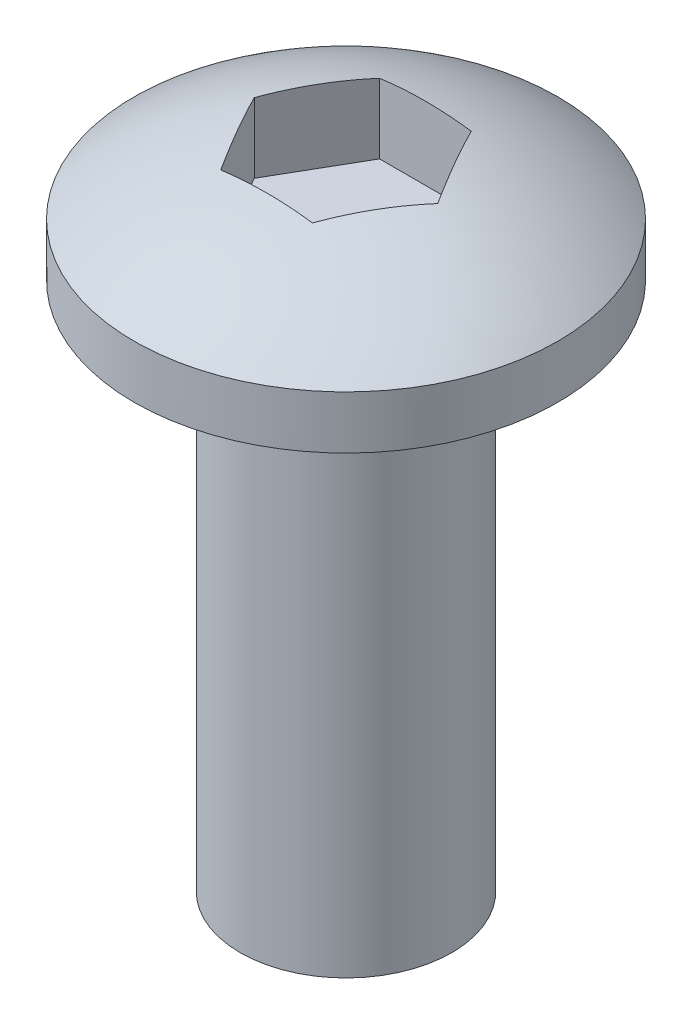
ISO-10303-21;
HEADER;
FILE_DESCRIPTION(('STEP AP214'),'2;1');
FILE_NAME('part.step','',(''),(''),'','','');
FILE_SCHEMA(('AUTOMOTIVE_DESIGN { 1 0 10303 214 1 1 1 1 }'));
ENDSEC;
DATA;
#1=APPLICATION_CONTEXT('core data for automotive mechanical design processes');
#2=APPLICATION_PROTOCOL_DEFINITION('international standard','automotive_design',2000,#1);
#3=PRODUCT_CONTEXT('',#1,'mechanical');
#4=PRODUCT('Part','Part','',(#3));
#5=PRODUCT_RELATED_PRODUCT_CATEGORY('part','',(#4));
#6=PRODUCT_DEFINITION_FORMATION('','',#4);
#7=PRODUCT_DEFINITION_CONTEXT('part definition',#1,'design');
#8=PRODUCT_DEFINITION('design','',#6,#7);
#9=PRODUCT_DEFINITION_SHAPE('','',#8);
#10=(LENGTH_UNIT() NAMED_UNIT(*) SI_UNIT(.MILLI.,.METRE.));
#11=(NAMED_UNIT(*) PLANE_ANGLE_UNIT() SI_UNIT($,.RADIAN.));
#12=(NAMED_UNIT(*) SI_UNIT($,.STERADIAN.) SOLID_ANGLE_UNIT());
#13=UNCERTAINTY_MEASURE_WITH_UNIT(LENGTH_MEASURE(1.E-05),#10,'distance_accuracy_value','');
#14=(GEOMETRIC_REPRESENTATION_CONTEXT(3) GLOBAL_UNCERTAINTY_ASSIGNED_CONTEXT((#13)) GLOBAL_UNIT_ASSIGNED_CONTEXT((#10,
#11,#12)) REPRESENTATION_CONTEXT('',''));
#15=CARTESIAN_POINT('',(0.,0.,0.));
#16=DIRECTION('',(0.,0.,1.));
#17=DIRECTION('',(1.,0.,0.));
#18=AXIS2_PLACEMENT_3D('',#15,#16,#17);
#19=CARTESIAN_POINT('',(0.,5.,0.));
#20=DIRECTION('',(0.,-1.,0.));
#21=DIRECTION('',(0.,0.,-1.));
#22=AXIS2_PLACEMENT_3D('',#19,#20,#21);
#23=CYLINDRICAL_SURFACE('',#22,1.);
#24=CARTESIAN_POINT('',(0.,5.,0.));
#25=DIRECTION('',(0.,1.,0.));
#26=DIRECTION('',(0.,0.,1.));
#27=AXIS2_PLACEMENT_3D('',#24,#25,#26);
#28=CIRCLE('',#27,1.);
#29=CARTESIAN_POINT('',(0.,5.,1.));
#30=VERTEX_POINT('',#29);
#31=EDGE_CURVE('E155',#30,#30,#28,.T.);
#32=ORIENTED_EDGE('',*,*,#31,.F.);
#33=EDGE_LOOP('',(#32));
#34=FACE_BOUND('',#33,.T.);
#35=CARTESIAN_POINT('',(0.,0.,0.));
#36=DIRECTION('',(0.,1.,0.));
#37=DIRECTION('',(0.,0.,1.));
#38=AXIS2_PLACEMENT_3D('',#35,#36,#37);
#39=CIRCLE('',#38,1.);
#40=CARTESIAN_POINT('',(0.,0.,1.));
#41=VERTEX_POINT('',#40);
#42=EDGE_CURVE('E154',#41,#41,#39,.T.);
#43=ORIENTED_EDGE('',*,*,#42,.T.);
#44=EDGE_LOOP('',(#43));
#45=FACE_BOUND('',#44,.T.);
#46=ADVANCED_FACE('F42',(#34,#45),#23,.T.);
#47=CARTESIAN_POINT('',(0.,0.,0.));
#48=DIRECTION('',(0.,1.,0.));
#49=DIRECTION('',(0.,0.,1.));
#50=AXIS2_PLACEMENT_3D('',#47,#48,#49);
#51=PLANE('',#50);
#52=ORIENTED_EDGE('',*,*,#42,.F.);
#53=EDGE_LOOP('',(#52));
#54=FACE_BOUND('',#53,.T.);
#55=ADVANCED_FACE('F200',(#54),#51,.F.);
#56=CARTESIAN_POINT('',(0.,5.,0.));
#57=DIRECTION('',(0.,-1.,0.));
#58=DIRECTION('',(0.,0.,-1.));
#59=AXIS2_PLACEMENT_3D('',#56,#57,#58);
#60=PLANE('',#59);
#61=ORIENTED_EDGE('',*,*,#31,.T.);
#62=EDGE_LOOP('',(#61));
#63=FACE_BOUND('',#62,.T.);
#64=CARTESIAN_POINT('',(0.,5.,0.));
#65=DIRECTION('',(0.,-1.,0.));
#66=DIRECTION('',(0.,0.,-1.));
#67=AXIS2_PLACEMENT_3D('',#64,#65,#66);
#68=CIRCLE('',#67,2.);
#69=CARTESIAN_POINT('',(0.,5.,-2.));
#70=VERTEX_POINT('',#69);
#71=EDGE_CURVE('E133',#70,#70,#68,.T.);
#72=ORIENTED_EDGE('',*,*,#71,.T.);
#73=EDGE_LOOP('',(#72));
#74=FACE_BOUND('',#73,.T.);
#75=ADVANCED_FACE('F205',(#63,#74),#60,.T.);
#76=CARTESIAN_POINT('',(0.,2.87511905031866,0.));
#77=DIRECTION('',(0.,-1.,0.));
#78=DIRECTION('',(1.,0.,0.));
#79=AXIS2_PLACEMENT_3D('',#76,#77,#78);
#80=SPHERICAL_SURFACE('',#79,3.3);
#81=CARTESIAN_POINT('',(0.649519052838329,2.87511905031866,0.375));
#82=DIRECTION('',(0.866025403784439,0.,0.5));
#83=DIRECTION('',(0.5,0.,-0.866025403784439));
#84=AXIS2_PLACEMENT_3D('',#81,#82,#83);
#85=CIRCLE('',#84,3.21364279284428);
#86=CARTESIAN_POINT('',(0.866025403784439,6.05945571593679,0.));
#87=VERTEX_POINT('',#86);
#88=CARTESIAN_POINT('',(0.433012701892219,6.05945571593679,0.750000000000001));
#89=VERTEX_POINT('',#88);
#90=EDGE_CURVE('E159',#87,#89,#85,.T.);
#91=ORIENTED_EDGE('',*,*,#90,.T.);
#92=CARTESIAN_POINT('',(0.,2.87511905031866,0.750000000000001));
#93=DIRECTION('',(0.,0.,1.));
#94=DIRECTION('',(1.,0.,0.));
#95=AXIS2_PLACEMENT_3D('',#92,#93,#94);
#96=CIRCLE('',#95,3.21364279284428);
#97=CARTESIAN_POINT('',(-0.43301270189222,6.05945571593679,0.750000000000001));
#98=VERTEX_POINT('',#97);
#99=EDGE_CURVE('E11',#89,#98,#96,.T.);
#100=ORIENTED_EDGE('',*,*,#99,.T.);
#101=CARTESIAN_POINT('',(-0.64951905283833,2.87511905031866,0.375000000000001));
#102=DIRECTION('',(-0.866025403784439,0.,0.5));
#103=DIRECTION('',(0.5,0.,0.866025403784439));
#104=AXIS2_PLACEMENT_3D('',#101,#102,#103);
#105=CIRCLE('',#104,3.21364279284428);
#106=CARTESIAN_POINT('',(-0.86602540378444,6.05945571593679,0.));
#107=VERTEX_POINT('',#106);
#108=EDGE_CURVE('E50',#98,#107,#105,.T.);
#109=ORIENTED_EDGE('',*,*,#108,.T.);
#110=CARTESIAN_POINT('',(-0.64951905283833,2.87511905031866,-0.375));
#111=DIRECTION('',(-0.866025403784439,0.,-0.5));
#112=DIRECTION('',(-0.5,0.,0.866025403784439));
#113=AXIS2_PLACEMENT_3D('',#110,#111,#112);
#114=CIRCLE('',#113,3.21364279284428);
#115=CARTESIAN_POINT('',(-0.43301270189222,6.05945571593679,-0.750000000000002));
#116=VERTEX_POINT('',#115);
#117=EDGE_CURVE('E173',#107,#116,#114,.T.);
#118=ORIENTED_EDGE('',*,*,#117,.T.);
#119=CARTESIAN_POINT('',(0.,2.87511905031866,-0.750000000000002));
#120=DIRECTION('',(0.,0.,-1.));
#121=DIRECTION('',(-1.,0.,0.));
#122=AXIS2_PLACEMENT_3D('',#119,#120,#121);
#123=CIRCLE('',#122,3.21364279284428);
#124=CARTESIAN_POINT('',(0.433012701892218,6.05945571593679,-0.750000000000002));
#125=VERTEX_POINT('',#124);
#126=EDGE_CURVE('E169',#116,#125,#123,.T.);
#127=ORIENTED_EDGE('',*,*,#126,.T.);
#128=CARTESIAN_POINT('',(0.649519052838329,2.87511905031866,-0.375));
#129=DIRECTION('',(0.866025403784438,0.,-0.5));
#130=DIRECTION('',(-0.5,0.,-0.866025403784439));
#131=AXIS2_PLACEMENT_3D('',#128,#129,#130);
#132=CIRCLE('',#131,3.21364279284428);
#133=EDGE_CURVE('E165',#125,#87,#132,.T.);
#134=ORIENTED_EDGE('',*,*,#133,.T.);
#135=EDGE_LOOP('',(#91,#100,#109,#118,#127,#134));
#136=FACE_BOUND('',#135,.T.);
#137=CARTESIAN_POINT('',(0.,5.5,0.));
#138=DIRECTION('',(0.,-1.,0.));
#139=DIRECTION('',(0.,0.,-1.));
#140=AXIS2_PLACEMENT_3D('',#137,#138,#139);
#141=CIRCLE('',#140,2.);
#142=CARTESIAN_POINT('',(0.,5.5,-2.));
#143=VERTEX_POINT('',#142);
#144=EDGE_CURVE('E150',#143,#143,#141,.T.);
#145=ORIENTED_EDGE('',*,*,#144,.F.);
#146=EDGE_LOOP('',(#145));
#147=FACE_BOUND('',#146,.T.);
#148=ADVANCED_FACE('F178',(#136,#147),#80,.T.);
#149=CARTESIAN_POINT('',(0.,5.,0.));
#150=DIRECTION('',(0.,-1.,0.));
#151=DIRECTION('',(0.,0.,-1.));
#152=AXIS2_PLACEMENT_3D('',#149,#150,#151);
#153=CYLINDRICAL_SURFACE('',#152,2.);
#154=ORIENTED_EDGE('',*,*,#144,.T.);
#155=EDGE_LOOP('',(#154));
#156=FACE_BOUND('',#155,.T.);
#157=ORIENTED_EDGE('',*,*,#71,.F.);
#158=EDGE_LOOP('',(#157));
#159=FACE_BOUND('',#158,.T.);
#160=ADVANCED_FACE('F196',(#156,#159),#153,.T.);
#161=CARTESIAN_POINT('',(-0.43301270189222,5.4,0.750000000000001));
#162=DIRECTION('',(0.,0.,1.));
#163=DIRECTION('',(1.,0.,0.));
#164=AXIS2_PLACEMENT_3D('',#161,#162,#163);
#165=PLANE('',#164);
#166=DIRECTION('',(0.,1.,0.));
#167=VECTOR('',#166,1.);
#168=CARTESIAN_POINT('',(0.433012701892219,5.4,0.750000000000001));
#169=LINE('',#168,#167);
#170=CARTESIAN_POINT('',(0.433012701892219,5.4,0.750000000000001));
#171=VERTEX_POINT('',#170);
#172=EDGE_CURVE('E57',#171,#89,#169,.T.);
#173=ORIENTED_EDGE('',*,*,#172,.F.);
#174=DIRECTION('',(1.,0.,0.));
#175=VECTOR('',#174,1.);
#176=CARTESIAN_POINT('',(-0.43301270189222,5.4,0.750000000000001));
#177=LINE('',#176,#175);
#178=CARTESIAN_POINT('',(-0.43301270189222,5.4,0.750000000000001));
#179=VERTEX_POINT('',#178);
#180=EDGE_CURVE('E96',#179,#171,#177,.T.);
#181=ORIENTED_EDGE('',*,*,#180,.F.);
#182=DIRECTION('',(0.,1.,0.));
#183=VECTOR('',#182,1.);
#184=CARTESIAN_POINT('',(-0.43301270189222,5.4,0.750000000000001));
#185=LINE('',#184,#183);
#186=EDGE_CURVE('E130',#179,#98,#185,.T.);
#187=ORIENTED_EDGE('',*,*,#186,.T.);
#188=ORIENTED_EDGE('',*,*,#99,.F.);
#189=EDGE_LOOP('',(#173,#181,#187,#188));
#190=FACE_BOUND('',#189,.T.);
#191=ADVANCED_FACE('F94',(#190),#165,.F.);
#192=CARTESIAN_POINT('',(-0.86602540378444,5.4,0.));
#193=DIRECTION('',(-0.866025403784439,0.,0.5));
#194=DIRECTION('',(0.5,0.,0.866025403784439));
#195=AXIS2_PLACEMENT_3D('',#192,#193,#194);
#196=PLANE('',#195);
#197=ORIENTED_EDGE('',*,*,#186,.F.);
#198=DIRECTION('',(0.5,0.,0.866025403784439));
#199=VECTOR('',#198,1.);
#200=CARTESIAN_POINT('',(-0.86602540378444,5.4,0.));
#201=LINE('',#200,#199);
#202=CARTESIAN_POINT('',(-0.86602540378444,5.4,0.));
#203=VERTEX_POINT('',#202);
#204=EDGE_CURVE('E101',#203,#179,#201,.T.);
#205=ORIENTED_EDGE('',*,*,#204,.F.);
#206=DIRECTION('',(0.,1.,0.));
#207=VECTOR('',#206,1.);
#208=CARTESIAN_POINT('',(-0.86602540378444,5.4,0.));
#209=LINE('',#208,#207);
#210=EDGE_CURVE('E134',#203,#107,#209,.T.);
#211=ORIENTED_EDGE('',*,*,#210,.T.);
#212=ORIENTED_EDGE('',*,*,#108,.F.);
#213=EDGE_LOOP('',(#197,#205,#211,#212));
#214=FACE_BOUND('',#213,.T.);
#215=ADVANCED_FACE('F188',(#214),#196,.F.);
#216=CARTESIAN_POINT('',(-0.43301270189222,5.4,-0.750000000000002));
#217=DIRECTION('',(-0.866025403784439,0.,-0.5));
#218=DIRECTION('',(-0.5,0.,0.866025403784439));
#219=AXIS2_PLACEMENT_3D('',#216,#217,#218);
#220=PLANE('',#219);
#221=ORIENTED_EDGE('',*,*,#210,.F.);
#222=DIRECTION('',(-0.5,0.,0.866025403784439));
#223=VECTOR('',#222,1.);
#224=CARTESIAN_POINT('',(-0.43301270189222,5.4,-0.750000000000002));
#225=LINE('',#224,#223);
#226=CARTESIAN_POINT('',(-0.43301270189222,5.4,-0.750000000000002));
#227=VERTEX_POINT('',#226);
#228=EDGE_CURVE('E125',#227,#203,#225,.T.);
#229=ORIENTED_EDGE('',*,*,#228,.F.);
#230=DIRECTION('',(0.,1.,0.));
#231=VECTOR('',#230,1.);
#232=CARTESIAN_POINT('',(-0.43301270189222,5.4,-0.750000000000002));
#233=LINE('',#232,#231);
#234=EDGE_CURVE('E137',#227,#116,#233,.T.);
#235=ORIENTED_EDGE('',*,*,#234,.T.);
#236=ORIENTED_EDGE('',*,*,#117,.F.);
#237=EDGE_LOOP('',(#221,#229,#235,#236));
#238=FACE_BOUND('',#237,.T.);
#239=ADVANCED_FACE('F187',(#238),#220,.F.);
#240=CARTESIAN_POINT('',(0.433012701892218,5.4,-0.750000000000002));
#241=DIRECTION('',(0.,0.,-1.));
#242=DIRECTION('',(-1.,0.,0.));
#243=AXIS2_PLACEMENT_3D('',#240,#241,#242);
#244=PLANE('',#243);
#245=ORIENTED_EDGE('',*,*,#234,.F.);
#246=DIRECTION('',(-1.,0.,0.));
#247=VECTOR('',#246,1.);
#248=CARTESIAN_POINT('',(0.433012701892218,5.4,-0.750000000000002));
#249=LINE('',#248,#247);
#250=CARTESIAN_POINT('',(0.433012701892218,5.4,-0.750000000000002));
#251=VERTEX_POINT('',#250);
#252=EDGE_CURVE('E121',#251,#227,#249,.T.);
#253=ORIENTED_EDGE('',*,*,#252,.F.);
#254=DIRECTION('',(0.,1.,0.));
#255=VECTOR('',#254,1.);
#256=CARTESIAN_POINT('',(0.433012701892218,5.4,-0.750000000000002));
#257=LINE('',#256,#255);
#258=EDGE_CURVE('E141',#251,#125,#257,.T.);
#259=ORIENTED_EDGE('',*,*,#258,.T.);
#260=ORIENTED_EDGE('',*,*,#126,.F.);
#261=EDGE_LOOP('',(#245,#253,#259,#260));
#262=FACE_BOUND('',#261,.T.);
#263=ADVANCED_FACE('F185',(#262),#244,.F.);
#264=CARTESIAN_POINT('',(0.866025403784439,5.4,0.));
#265=DIRECTION('',(0.866025403784438,0.,-0.5));
#266=DIRECTION('',(-0.5,0.,-0.866025403784439));
#267=AXIS2_PLACEMENT_3D('',#264,#265,#266);
#268=PLANE('',#267);
#269=ORIENTED_EDGE('',*,*,#258,.F.);
#270=DIRECTION('',(-0.5,0.,-0.866025403784439));
#271=VECTOR('',#270,1.);
#272=CARTESIAN_POINT('',(0.866025403784439,5.4,0.));
#273=LINE('',#272,#271);
#274=CARTESIAN_POINT('',(0.866025403784439,5.4,0.));
#275=VERTEX_POINT('',#274);
#276=EDGE_CURVE('E111',#275,#251,#273,.T.);
#277=ORIENTED_EDGE('',*,*,#276,.F.);
#278=DIRECTION('',(0.,1.,0.));
#279=VECTOR('',#278,1.);
#280=CARTESIAN_POINT('',(0.866025403784439,5.4,0.));
#281=LINE('',#280,#279);
#282=EDGE_CURVE('E100',#275,#87,#281,.T.);
#283=ORIENTED_EDGE('',*,*,#282,.T.);
#284=ORIENTED_EDGE('',*,*,#133,.F.);
#285=EDGE_LOOP('',(#269,#277,#283,#284));
#286=FACE_BOUND('',#285,.T.);
#287=ADVANCED_FACE('F181',(#286),#268,.F.);
#288=CARTESIAN_POINT('',(0.433012701892219,5.4,0.750000000000001));
#289=DIRECTION('',(0.866025403784439,0.,0.5));
#290=DIRECTION('',(0.5,0.,-0.866025403784439));
#291=AXIS2_PLACEMENT_3D('',#288,#289,#290);
#292=PLANE('',#291);
#293=ORIENTED_EDGE('',*,*,#282,.F.);
#294=DIRECTION('',(0.5,0.,-0.866025403784439));
#295=VECTOR('',#294,1.);
#296=CARTESIAN_POINT('',(0.433012701892219,5.4,0.750000000000001));
#297=LINE('',#296,#295);
#298=EDGE_CURVE('E104',#171,#275,#297,.T.);
#299=ORIENTED_EDGE('',*,*,#298,.F.);
#300=ORIENTED_EDGE('',*,*,#172,.T.);
#301=ORIENTED_EDGE('',*,*,#90,.F.);
#302=EDGE_LOOP('',(#293,#299,#300,#301));
#303=FACE_BOUND('',#302,.T.);
#304=ADVANCED_FACE('F105',(#303),#292,.F.);
#305=CARTESIAN_POINT('',(0.,5.4,0.));
#306=DIRECTION('',(0.,1.,0.));
#307=DIRECTION('',(0.,0.,1.));
#308=AXIS2_PLACEMENT_3D('',#305,#306,#307);
#309=PLANE('',#308);
#310=ORIENTED_EDGE('',*,*,#180,.T.);
#311=ORIENTED_EDGE('',*,*,#298,.T.);
#312=ORIENTED_EDGE('',*,*,#276,.T.);
#313=ORIENTED_EDGE('',*,*,#252,.T.);
#314=ORIENTED_EDGE('',*,*,#228,.T.);
#315=ORIENTED_EDGE('',*,*,#204,.T.);
#316=EDGE_LOOP('',(#310,#311,#312,#313,#314,#315));
#317=FACE_BOUND('',#316,.T.);
#318=ADVANCED_FACE('F113',(#317),#309,.T.);
#319=CLOSED_SHELL('',(#46,#55,#75,#148,#160,#191,#215,#239,#263,#287,#304,#318));
#320=MANIFOLD_SOLID_BREP('B2',#319);
#321=ADVANCED_BREP_SHAPE_REPRESENTATION('',(#18,#320),#14);
#322=SHAPE_DEFINITION_REPRESENTATION(#9,#321);
ENDSEC;
END-ISO-10303-21;
